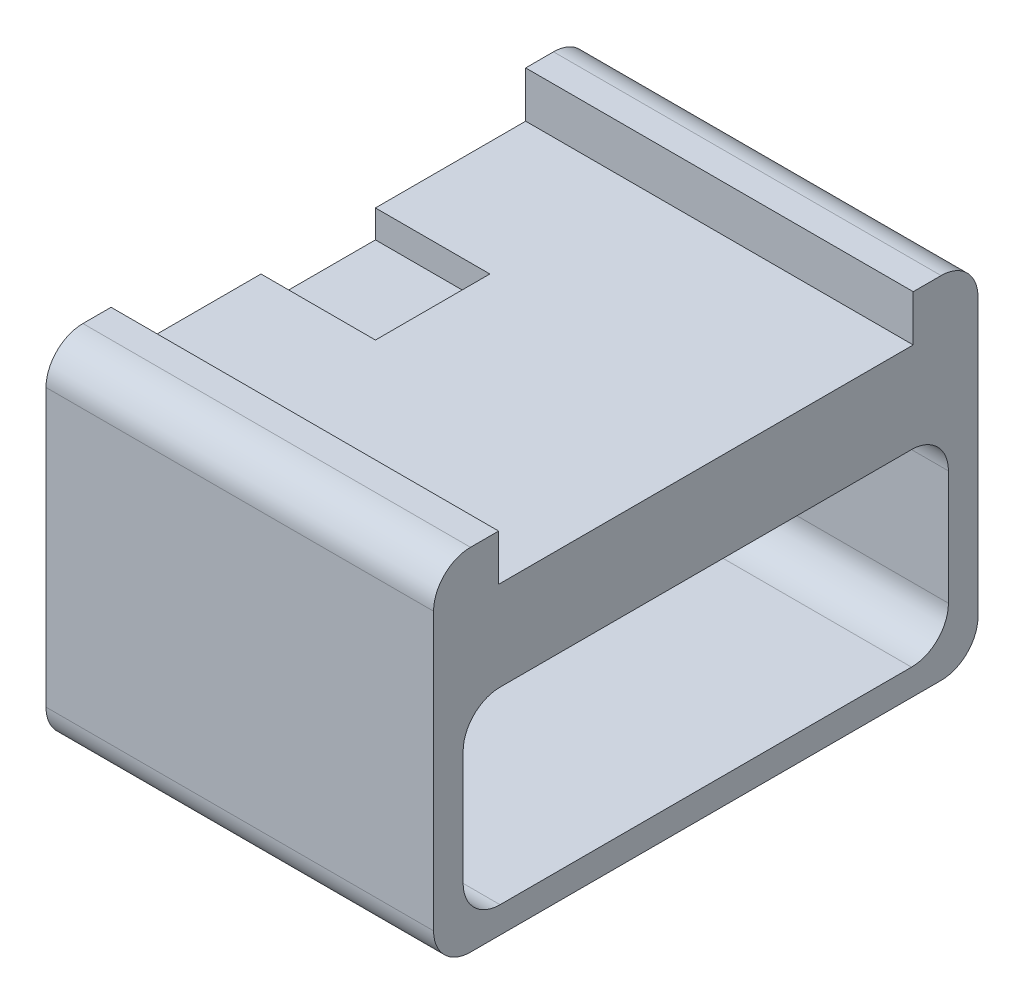
ISO-10303-21;
HEADER;
FILE_DESCRIPTION(('STEP AP214'),'2;1');
FILE_NAME('part.step','',(''),(''),'','','');
FILE_SCHEMA(('AUTOMOTIVE_DESIGN { 1 0 10303 214 1 1 1 1 }'));
ENDSEC;
DATA;
#1=APPLICATION_CONTEXT('core data for automotive mechanical design processes');
#2=APPLICATION_PROTOCOL_DEFINITION('international standard','automotive_design',2000,#1);
#3=PRODUCT_CONTEXT('',#1,'mechanical');
#4=PRODUCT('Part','Part','',(#3));
#5=PRODUCT_RELATED_PRODUCT_CATEGORY('part','',(#4));
#6=PRODUCT_DEFINITION_FORMATION('','',#4);
#7=PRODUCT_DEFINITION_CONTEXT('part definition',#1,'design');
#8=PRODUCT_DEFINITION('design','',#6,#7);
#9=PRODUCT_DEFINITION_SHAPE('','',#8);
#10=(LENGTH_UNIT() NAMED_UNIT(*) SI_UNIT(.MILLI.,.METRE.));
#11=(NAMED_UNIT(*) PLANE_ANGLE_UNIT() SI_UNIT($,.RADIAN.));
#12=(NAMED_UNIT(*) SI_UNIT($,.STERADIAN.) SOLID_ANGLE_UNIT());
#13=UNCERTAINTY_MEASURE_WITH_UNIT(LENGTH_MEASURE(1.E-05),#10,'distance_accuracy_value','');
#14=(GEOMETRIC_REPRESENTATION_CONTEXT(3) GLOBAL_UNCERTAINTY_ASSIGNED_CONTEXT((#13)) GLOBAL_UNIT_ASSIGNED_CONTEXT((#10,
#11,#12)) REPRESENTATION_CONTEXT('',''));
#15=CARTESIAN_POINT('',(0.,0.,0.));
#16=DIRECTION('',(0.,0.,1.));
#17=DIRECTION('',(1.,0.,0.));
#18=AXIS2_PLACEMENT_3D('',#15,#16,#17);
#19=CARTESIAN_POINT('',(21.,9.5,12.75));
#20=DIRECTION('',(0.,-1.,0.));
#21=DIRECTION('',(0.,0.,-1.));
#22=AXIS2_PLACEMENT_3D('',#19,#20,#21);
#23=PLANE('',#22);
#24=DIRECTION('',(0.,0.,1.));
#25=VECTOR('',#24,1.);
#26=CARTESIAN_POINT('',(0.,9.5,12.75));
#27=LINE('',#26,#25);
#28=CARTESIAN_POINT('',(0.,9.5,-12.75));
#29=VERTEX_POINT('',#28);
#30=CARTESIAN_POINT('',(0.,9.5,-11.2400373427258));
#31=VERTEX_POINT('',#30);
#32=EDGE_CURVE('E197',#29,#31,#27,.T.);
#33=ORIENTED_EDGE('',*,*,#32,.T.);
#34=DIRECTION('',(-1.,0.,0.));
#35=VECTOR('',#34,1.);
#36=CARTESIAN_POINT('',(0.,9.5,-11.2400373427258));
#37=LINE('',#36,#35);
#38=CARTESIAN_POINT('',(21.,9.5,-11.2400373427258));
#39=VERTEX_POINT('',#38);
#40=EDGE_CURVE('E317',#39,#31,#37,.T.);
#41=ORIENTED_EDGE('',*,*,#40,.F.);
#42=DIRECTION('',(0.,0.,1.));
#43=VECTOR('',#42,1.);
#44=CARTESIAN_POINT('',(21.,9.5,12.75));
#45=LINE('',#44,#43);
#46=CARTESIAN_POINT('',(21.,9.5,-12.75));
#47=VERTEX_POINT('',#46);
#48=EDGE_CURVE('E285',#47,#39,#45,.T.);
#49=ORIENTED_EDGE('',*,*,#48,.F.);
#50=DIRECTION('',(-1.,0.,0.));
#51=VECTOR('',#50,1.);
#52=CARTESIAN_POINT('',(21.,9.5,-12.75));
#53=LINE('',#52,#51);
#54=EDGE_CURVE('E215',#47,#29,#53,.T.);
#55=ORIENTED_EDGE('',*,*,#54,.T.);
#56=EDGE_LOOP('',(#33,#41,#49,#55));
#57=FACE_BOUND('',#56,.T.);
#58=ADVANCED_FACE('F33',(#57),#23,.F.);
#59=CARTESIAN_POINT('',(6.2,5.5,-3.1));
#60=DIRECTION('',(1.,0.,0.));
#61=DIRECTION('',(0.,0.,-1.));
#62=AXIS2_PLACEMENT_3D('',#59,#60,#61);
#63=PLANE('',#62);
#64=DIRECTION('',(0.,0.,1.));
#65=VECTOR('',#64,1.);
#66=CARTESIAN_POINT('',(6.2,7.,-3.1));
#67=LINE('',#66,#65);
#68=CARTESIAN_POINT('',(6.2,7.,-3.1));
#69=VERTEX_POINT('',#68);
#70=CARTESIAN_POINT('',(6.2,7.,3.1));
#71=VERTEX_POINT('',#70);
#72=EDGE_CURVE('E333',#69,#71,#67,.T.);
#73=ORIENTED_EDGE('',*,*,#72,.F.);
#74=DIRECTION('',(0.,1.,0.));
#75=VECTOR('',#74,1.);
#76=CARTESIAN_POINT('',(6.2,5.5,-3.1));
#77=LINE('',#76,#75);
#78=CARTESIAN_POINT('',(6.2,5.5,-3.1));
#79=VERTEX_POINT('',#78);
#80=EDGE_CURVE('E98',#79,#69,#77,.T.);
#81=ORIENTED_EDGE('',*,*,#80,.F.);
#82=DIRECTION('',(0.,0.,-1.));
#83=VECTOR('',#82,1.);
#84=CARTESIAN_POINT('',(6.2,5.5,-3.1));
#85=LINE('',#84,#83);
#86=CARTESIAN_POINT('',(6.2,5.5,3.1));
#87=VERTEX_POINT('',#86);
#88=EDGE_CURVE('E262',#87,#79,#85,.T.);
#89=ORIENTED_EDGE('',*,*,#88,.F.);
#90=DIRECTION('',(0.,1.,0.));
#91=VECTOR('',#90,1.);
#92=CARTESIAN_POINT('',(6.2,5.5,3.1));
#93=LINE('',#92,#91);
#94=EDGE_CURVE('E185',#87,#71,#93,.T.);
#95=ORIENTED_EDGE('',*,*,#94,.T.);
#96=EDGE_LOOP('',(#73,#81,#89,#95));
#97=FACE_BOUND('',#96,.T.);
#98=ADVANCED_FACE('F459',(#97),#63,.F.);
#99=CARTESIAN_POINT('',(6.2,5.5,3.1));
#100=DIRECTION('',(0.,0.,1.));
#101=DIRECTION('',(1.,0.,0.));
#102=AXIS2_PLACEMENT_3D('',#99,#100,#101);
#103=PLANE('',#102);
#104=DIRECTION('',(-1.,0.,0.));
#105=VECTOR('',#104,1.);
#106=CARTESIAN_POINT('',(6.2,7.,3.1));
#107=LINE('',#106,#105);
#108=CARTESIAN_POINT('',(0.,7.,3.1));
#109=VERTEX_POINT('',#108);
#110=EDGE_CURVE('E340',#71,#109,#107,.T.);
#111=ORIENTED_EDGE('',*,*,#110,.F.);
#112=ORIENTED_EDGE('',*,*,#94,.F.);
#113=DIRECTION('',(1.,0.,0.));
#114=VECTOR('',#113,1.);
#115=CARTESIAN_POINT('',(6.2,5.5,3.1));
#116=LINE('',#115,#114);
#117=CARTESIAN_POINT('',(0.,5.5,3.1));
#118=VERTEX_POINT('',#117);
#119=EDGE_CURVE('E270',#118,#87,#116,.T.);
#120=ORIENTED_EDGE('',*,*,#119,.F.);
#121=DIRECTION('',(0.,1.,0.));
#122=VECTOR('',#121,1.);
#123=CARTESIAN_POINT('',(0.,5.5,3.1));
#124=LINE('',#123,#122);
#125=EDGE_CURVE('E190',#118,#109,#124,.T.);
#126=ORIENTED_EDGE('',*,*,#125,.T.);
#127=EDGE_LOOP('',(#111,#112,#120,#126));
#128=FACE_BOUND('',#127,.T.);
#129=ADVANCED_FACE('F461',(#128),#103,.F.);
#130=CARTESIAN_POINT('',(6.2,5.5,-3.1));
#131=DIRECTION('',(0.,0.,-1.));
#132=DIRECTION('',(-1.,0.,0.));
#133=AXIS2_PLACEMENT_3D('',#130,#131,#132);
#134=PLANE('',#133);
#135=DIRECTION('',(1.,0.,0.));
#136=VECTOR('',#135,1.);
#137=CARTESIAN_POINT('',(6.2,7.,-3.1));
#138=LINE('',#137,#136);
#139=CARTESIAN_POINT('',(0.,7.,-3.1));
#140=VERTEX_POINT('',#139);
#141=EDGE_CURVE('E11',#140,#69,#138,.T.);
#142=ORIENTED_EDGE('',*,*,#141,.F.);
#143=DIRECTION('',(0.,1.,0.));
#144=VECTOR('',#143,1.);
#145=CARTESIAN_POINT('',(0.,5.5,-3.1));
#146=LINE('',#145,#144);
#147=CARTESIAN_POINT('',(0.,5.5,-3.1));
#148=VERTEX_POINT('',#147);
#149=EDGE_CURVE('E275',#148,#140,#146,.T.);
#150=ORIENTED_EDGE('',*,*,#149,.F.);
#151=DIRECTION('',(-1.,0.,0.));
#152=VECTOR('',#151,1.);
#153=CARTESIAN_POINT('',(6.2,5.5,-3.1));
#154=LINE('',#153,#152);
#155=EDGE_CURVE('E265',#79,#148,#154,.T.);
#156=ORIENTED_EDGE('',*,*,#155,.F.);
#157=ORIENTED_EDGE('',*,*,#80,.T.);
#158=EDGE_LOOP('',(#142,#150,#156,#157));
#159=FACE_BOUND('',#158,.T.);
#160=ADVANCED_FACE('F455',(#159),#134,.F.);
#161=CARTESIAN_POINT('',(21.,-7.5,-12.75));
#162=DIRECTION('',(-1.,0.,0.));
#163=DIRECTION('',(0.,0.,1.));
#164=AXIS2_PLACEMENT_3D('',#161,#162,#163);
#165=CYLINDRICAL_SURFACE('',#164,2.);
#166=CARTESIAN_POINT('',(0.,-7.5,-12.75));
#167=DIRECTION('',(1.,0.,0.));
#168=DIRECTION('',(0.,0.,1.));
#169=AXIS2_PLACEMENT_3D('',#166,#167,#168);
#170=CIRCLE('',#169,2.);
#171=CARTESIAN_POINT('',(0.,-9.5,-12.75));
#172=VERTEX_POINT('',#171);
#173=CARTESIAN_POINT('',(0.,-7.5,-14.75));
#174=VERTEX_POINT('',#173);
#175=EDGE_CURVE('E175',#172,#174,#170,.T.);
#176=ORIENTED_EDGE('',*,*,#175,.T.);
#177=DIRECTION('',(-1.,0.,0.));
#178=VECTOR('',#177,1.);
#179=CARTESIAN_POINT('',(21.,-7.5,-14.75));
#180=LINE('',#179,#178);
#181=CARTESIAN_POINT('',(21.,-7.5,-14.75));
#182=VERTEX_POINT('',#181);
#183=EDGE_CURVE('E221',#182,#174,#180,.T.);
#184=ORIENTED_EDGE('',*,*,#183,.F.);
#185=CARTESIAN_POINT('',(21.,-7.5,-12.75));
#186=DIRECTION('',(1.,0.,0.));
#187=DIRECTION('',(0.,0.,1.));
#188=AXIS2_PLACEMENT_3D('',#185,#186,#187);
#189=CIRCLE('',#188,2.);
#190=CARTESIAN_POINT('',(21.,-9.5,-12.75));
#191=VERTEX_POINT('',#190);
#192=EDGE_CURVE('E169',#191,#182,#189,.T.);
#193=ORIENTED_EDGE('',*,*,#192,.F.);
#194=DIRECTION('',(-1.,0.,0.));
#195=VECTOR('',#194,1.);
#196=CARTESIAN_POINT('',(21.,-9.5,-12.75));
#197=LINE('',#196,#195);
#198=EDGE_CURVE('E162',#191,#172,#197,.T.);
#199=ORIENTED_EDGE('',*,*,#198,.T.);
#200=EDGE_LOOP('',(#176,#184,#193,#199));
#201=FACE_BOUND('',#200,.T.);
#202=ADVANCED_FACE('F35',(#201),#165,.T.);
#203=CARTESIAN_POINT('',(21.,-7.5,-14.75));
#204=DIRECTION('',(0.,0.,1.));
#205=DIRECTION('',(0.,-1.,0.));
#206=AXIS2_PLACEMENT_3D('',#203,#204,#205);
#207=PLANE('',#206);
#208=DIRECTION('',(0.,1.,0.));
#209=VECTOR('',#208,1.);
#210=CARTESIAN_POINT('',(0.,-7.5,-14.75));
#211=LINE('',#210,#209);
#212=CARTESIAN_POINT('',(0.,7.5,-14.75));
#213=VERTEX_POINT('',#212);
#214=EDGE_CURVE('E183',#174,#213,#211,.T.);
#215=ORIENTED_EDGE('',*,*,#214,.T.);
#216=DIRECTION('',(-1.,0.,0.));
#217=VECTOR('',#216,1.);
#218=CARTESIAN_POINT('',(21.,7.5,-14.75));
#219=LINE('',#218,#217);
#220=CARTESIAN_POINT('',(21.,7.5,-14.75));
#221=VERTEX_POINT('',#220);
#222=EDGE_CURVE('E218',#221,#213,#219,.T.);
#223=ORIENTED_EDGE('',*,*,#222,.F.);
#224=DIRECTION('',(0.,1.,0.));
#225=VECTOR('',#224,1.);
#226=CARTESIAN_POINT('',(21.,-7.5,-14.75));
#227=LINE('',#226,#225);
#228=EDGE_CURVE('E280',#182,#221,#227,.T.);
#229=ORIENTED_EDGE('',*,*,#228,.F.);
#230=ORIENTED_EDGE('',*,*,#183,.T.);
#231=EDGE_LOOP('',(#215,#223,#229,#230));
#232=FACE_BOUND('',#231,.T.);
#233=ADVANCED_FACE('F298',(#232),#207,.F.);
#234=CARTESIAN_POINT('',(21.,7.5,-12.75));
#235=DIRECTION('',(-1.,0.,0.));
#236=DIRECTION('',(0.,0.,1.));
#237=AXIS2_PLACEMENT_3D('',#234,#235,#236);
#238=CYLINDRICAL_SURFACE('',#237,2.);
#239=CARTESIAN_POINT('',(0.,7.5,-12.75));
#240=DIRECTION('',(1.,0.,0.));
#241=DIRECTION('',(0.,0.,1.));
#242=AXIS2_PLACEMENT_3D('',#239,#240,#241);
#243=CIRCLE('',#242,2.);
#244=EDGE_CURVE('E187',#213,#29,#243,.T.);
#245=ORIENTED_EDGE('',*,*,#244,.T.);
#246=ORIENTED_EDGE('',*,*,#54,.F.);
#247=CARTESIAN_POINT('',(21.,7.5,-12.75));
#248=DIRECTION('',(1.,0.,0.));
#249=DIRECTION('',(0.,0.,1.));
#250=AXIS2_PLACEMENT_3D('',#247,#248,#249);
#251=CIRCLE('',#250,2.);
#252=EDGE_CURVE('E282',#221,#47,#251,.T.);
#253=ORIENTED_EDGE('',*,*,#252,.F.);
#254=ORIENTED_EDGE('',*,*,#222,.T.);
#255=EDGE_LOOP('',(#245,#246,#253,#254));
#256=FACE_BOUND('',#255,.T.);
#257=ADVANCED_FACE('F302',(#256),#238,.T.);
#258=CARTESIAN_POINT('',(21.,9.5,11.2248067322085));
#259=VERTEX_POINT('',#258);
#260=CARTESIAN_POINT('',(21.,9.5,12.75));
#261=VERTEX_POINT('',#260);
#262=EDGE_CURVE('E284',#259,#261,#45,.T.);
#263=ORIENTED_EDGE('',*,*,#262,.F.);
#264=DIRECTION('',(1.,0.,0.));
#265=VECTOR('',#264,1.);
#266=CARTESIAN_POINT('',(0.,9.5,11.2248067322085));
#267=LINE('',#266,#265);
#268=CARTESIAN_POINT('',(0.,9.5,11.2248067322085));
#269=VERTEX_POINT('',#268);
#270=EDGE_CURVE('E323',#269,#259,#267,.T.);
#271=ORIENTED_EDGE('',*,*,#270,.F.);
#272=CARTESIAN_POINT('',(0.,9.5,12.75));
#273=VERTEX_POINT('',#272);
#274=EDGE_CURVE('E196',#269,#273,#27,.T.);
#275=ORIENTED_EDGE('',*,*,#274,.T.);
#276=DIRECTION('',(-1.,0.,0.));
#277=VECTOR('',#276,1.);
#278=CARTESIAN_POINT('',(21.,9.5,12.75));
#279=LINE('',#278,#277);
#280=EDGE_CURVE('E212',#261,#273,#279,.T.);
#281=ORIENTED_EDGE('',*,*,#280,.F.);
#282=EDGE_LOOP('',(#263,#271,#275,#281));
#283=FACE_BOUND('',#282,.T.);
#284=ADVANCED_FACE('F443',(#283),#23,.F.);
#285=CARTESIAN_POINT('',(21.,7.5,12.75));
#286=DIRECTION('',(-1.,0.,0.));
#287=DIRECTION('',(0.,0.,1.));
#288=AXIS2_PLACEMENT_3D('',#285,#286,#287);
#289=CYLINDRICAL_SURFACE('',#288,2.);
#290=CARTESIAN_POINT('',(0.,7.5,12.75));
#291=DIRECTION('',(1.,0.,0.));
#292=DIRECTION('',(0.,0.,-1.));
#293=AXIS2_PLACEMENT_3D('',#290,#291,#292);
#294=CIRCLE('',#293,2.);
#295=CARTESIAN_POINT('',(0.,7.5,14.75));
#296=VERTEX_POINT('',#295);
#297=EDGE_CURVE('E200',#273,#296,#294,.T.);
#298=ORIENTED_EDGE('',*,*,#297,.T.);
#299=DIRECTION('',(-1.,0.,0.));
#300=VECTOR('',#299,1.);
#301=CARTESIAN_POINT('',(21.,7.5,14.75));
#302=LINE('',#301,#300);
#303=CARTESIAN_POINT('',(21.,7.5,14.75));
#304=VERTEX_POINT('',#303);
#305=EDGE_CURVE('E209',#304,#296,#302,.T.);
#306=ORIENTED_EDGE('',*,*,#305,.F.);
#307=CARTESIAN_POINT('',(21.,7.5,12.75));
#308=DIRECTION('',(1.,0.,0.));
#309=DIRECTION('',(0.,0.,-1.));
#310=AXIS2_PLACEMENT_3D('',#307,#308,#309);
#311=CIRCLE('',#310,2.);
#312=EDGE_CURVE('E288',#261,#304,#311,.T.);
#313=ORIENTED_EDGE('',*,*,#312,.F.);
#314=ORIENTED_EDGE('',*,*,#280,.T.);
#315=EDGE_LOOP('',(#298,#306,#313,#314));
#316=FACE_BOUND('',#315,.T.);
#317=ADVANCED_FACE('F446',(#316),#289,.T.);
#318=CARTESIAN_POINT('',(21.,-7.5,14.75));
#319=DIRECTION('',(0.,0.,-1.));
#320=DIRECTION('',(-1.,0.,0.));
#321=AXIS2_PLACEMENT_3D('',#318,#319,#320);
#322=PLANE('',#321);
#323=DIRECTION('',(0.,-1.,0.));
#324=VECTOR('',#323,1.);
#325=CARTESIAN_POINT('',(0.,-7.5,14.75));
#326=LINE('',#325,#324);
#327=CARTESIAN_POINT('',(0.,-7.5,14.75));
#328=VERTEX_POINT('',#327);
#329=EDGE_CURVE('E202',#296,#328,#326,.T.);
#330=ORIENTED_EDGE('',*,*,#329,.T.);
#331=DIRECTION('',(-1.,0.,0.));
#332=VECTOR('',#331,1.);
#333=CARTESIAN_POINT('',(21.,-7.5,14.75));
#334=LINE('',#333,#332);
#335=CARTESIAN_POINT('',(21.,-7.5,14.75));
#336=VERTEX_POINT('',#335);
#337=EDGE_CURVE('E206',#336,#328,#334,.T.);
#338=ORIENTED_EDGE('',*,*,#337,.F.);
#339=DIRECTION('',(0.,-1.,0.));
#340=VECTOR('',#339,1.);
#341=CARTESIAN_POINT('',(21.,-7.5,14.75));
#342=LINE('',#341,#340);
#343=EDGE_CURVE('E290',#304,#336,#342,.T.);
#344=ORIENTED_EDGE('',*,*,#343,.F.);
#345=ORIENTED_EDGE('',*,*,#305,.T.);
#346=EDGE_LOOP('',(#330,#338,#344,#345));
#347=FACE_BOUND('',#346,.T.);
#348=ADVANCED_FACE('F482',(#347),#322,.F.);
#349=CARTESIAN_POINT('',(21.,-7.5,12.75));
#350=DIRECTION('',(-1.,0.,0.));
#351=DIRECTION('',(0.,0.,1.));
#352=AXIS2_PLACEMENT_3D('',#349,#350,#351);
#353=CYLINDRICAL_SURFACE('',#352,2.);
#354=CARTESIAN_POINT('',(0.,-7.5,12.75));
#355=DIRECTION('',(1.,0.,0.));
#356=DIRECTION('',(0.,0.,-1.));
#357=AXIS2_PLACEMENT_3D('',#354,#355,#356);
#358=CIRCLE('',#357,2.);
#359=CARTESIAN_POINT('',(0.,-9.5,12.75));
#360=VERTEX_POINT('',#359);
#361=EDGE_CURVE('E170',#328,#360,#358,.T.);
#362=ORIENTED_EDGE('',*,*,#361,.T.);
#363=DIRECTION('',(-1.,0.,0.));
#364=VECTOR('',#363,1.);
#365=CARTESIAN_POINT('',(21.,-9.5,12.75));
#366=LINE('',#365,#364);
#367=CARTESIAN_POINT('',(21.,-9.5,12.75));
#368=VERTEX_POINT('',#367);
#369=EDGE_CURVE('E165',#368,#360,#366,.T.);
#370=ORIENTED_EDGE('',*,*,#369,.F.);
#371=CARTESIAN_POINT('',(21.,-7.5,12.75));
#372=DIRECTION('',(1.,0.,0.));
#373=DIRECTION('',(0.,0.,-1.));
#374=AXIS2_PLACEMENT_3D('',#371,#372,#373);
#375=CIRCLE('',#374,2.);
#376=EDGE_CURVE('E291',#336,#368,#375,.T.);
#377=ORIENTED_EDGE('',*,*,#376,.F.);
#378=ORIENTED_EDGE('',*,*,#337,.T.);
#379=EDGE_LOOP('',(#362,#370,#377,#378));
#380=FACE_BOUND('',#379,.T.);
#381=ADVANCED_FACE('F636',(#380),#353,.T.);
#382=CARTESIAN_POINT('',(21.,-9.5,12.75));
#383=DIRECTION('',(0.,1.,0.));
#384=DIRECTION('',(0.,0.,1.));
#385=AXIS2_PLACEMENT_3D('',#382,#383,#384);
#386=PLANE('',#385);
#387=DIRECTION('',(0.,0.,-1.));
#388=VECTOR('',#387,1.);
#389=CARTESIAN_POINT('',(0.,-9.5,12.75));
#390=LINE('',#389,#388);
#391=EDGE_CURVE('E158',#360,#172,#390,.T.);
#392=ORIENTED_EDGE('',*,*,#391,.T.);
#393=ORIENTED_EDGE('',*,*,#198,.F.);
#394=DIRECTION('',(0.,0.,-1.));
#395=VECTOR('',#394,1.);
#396=CARTESIAN_POINT('',(21.,-9.5,12.75));
#397=LINE('',#396,#395);
#398=EDGE_CURVE('E177',#368,#191,#397,.T.);
#399=ORIENTED_EDGE('',*,*,#398,.F.);
#400=ORIENTED_EDGE('',*,*,#369,.T.);
#401=EDGE_LOOP('',(#392,#393,#399,#400));
#402=FACE_BOUND('',#401,.T.);
#403=ADVANCED_FACE('F160',(#402),#386,.F.);
#404=CARTESIAN_POINT('',(21.,-7.5,-12.75));
#405=DIRECTION('',(-1.,0.,0.));
#406=DIRECTION('',(0.,0.,1.));
#407=AXIS2_PLACEMENT_3D('',#404,#405,#406);
#408=PLANE('',#407);
#409=ORIENTED_EDGE('',*,*,#48,.T.);
#410=DIRECTION('',(0.,-1.,0.));
#411=VECTOR('',#410,1.);
#412=CARTESIAN_POINT('',(21.,-7.5,-11.2400373427258));
#413=LINE('',#412,#411);
#414=CARTESIAN_POINT('',(21.,7.,-11.2400373427258));
#415=VERTEX_POINT('',#414);
#416=EDGE_CURVE('E309',#39,#415,#413,.T.);
#417=ORIENTED_EDGE('',*,*,#416,.T.);
#418=DIRECTION('',(0.,0.,-1.));
#419=VECTOR('',#418,1.);
#420=CARTESIAN_POINT('',(21.,7.,-12.75));
#421=LINE('',#420,#419);
#422=CARTESIAN_POINT('',(21.,7.,11.2248067322085));
#423=VERTEX_POINT('',#422);
#424=EDGE_CURVE('E343',#423,#415,#421,.T.);
#425=ORIENTED_EDGE('',*,*,#424,.F.);
#426=DIRECTION('',(0.,1.,0.));
#427=VECTOR('',#426,1.);
#428=CARTESIAN_POINT('',(21.,-7.5,11.2248067322085));
#429=LINE('',#428,#427);
#430=EDGE_CURVE('E346',#423,#259,#429,.T.);
#431=ORIENTED_EDGE('',*,*,#430,.T.);
#432=ORIENTED_EDGE('',*,*,#262,.T.);
#433=ORIENTED_EDGE('',*,*,#312,.T.);
#434=ORIENTED_EDGE('',*,*,#343,.T.);
#435=ORIENTED_EDGE('',*,*,#376,.T.);
#436=ORIENTED_EDGE('',*,*,#398,.T.);
#437=ORIENTED_EDGE('',*,*,#192,.T.);
#438=ORIENTED_EDGE('',*,*,#228,.T.);
#439=ORIENTED_EDGE('',*,*,#252,.T.);
#440=EDGE_LOOP('',(#409,#417,#425,#431,#432,#433,#434,#435,#436,#437,#438,#439));
#441=FACE_BOUND('',#440,.T.);
#442=DIRECTION('',(0.,0.,1.));
#443=VECTOR('',#442,1.);
#444=CARTESIAN_POINT('',(21.,-8.07292875406995,-11.147623692795));
#445=LINE('',#444,#443);
#446=CARTESIAN_POINT('',(21.,-8.07292875406995,-11.147623692795));
#447=VERTEX_POINT('',#446);
#448=CARTESIAN_POINT('',(21.,-8.07292875406995,11.147623692795));
#449=VERTEX_POINT('',#448);
#450=EDGE_CURVE('E258',#447,#449,#445,.T.);
#451=ORIENTED_EDGE('',*,*,#450,.T.);
#452=CARTESIAN_POINT('',(21.,-6.07292875406995,11.147623692795));
#453=DIRECTION('',(-1.,0.,0.));
#454=DIRECTION('',(0.,0.,1.));
#455=AXIS2_PLACEMENT_3D('',#452,#453,#454);
#456=CIRCLE('',#455,2.);
#457=CARTESIAN_POINT('',(21.,-6.07292875406995,13.147623692795));
#458=VERTEX_POINT('',#457);
#459=EDGE_CURVE('E350',#449,#458,#456,.T.);
#460=ORIENTED_EDGE('',*,*,#459,.T.);
#461=DIRECTION('',(0.,1.,0.));
#462=VECTOR('',#461,1.);
#463=CARTESIAN_POINT('',(21.,-6.07292875406995,13.147623692795));
#464=LINE('',#463,#462);
#465=CARTESIAN_POINT('',(21.,0.135263403800992,13.147623692795));
#466=VERTEX_POINT('',#465);
#467=EDGE_CURVE('E353',#458,#466,#464,.T.);
#468=ORIENTED_EDGE('',*,*,#467,.T.);
#469=CARTESIAN_POINT('',(21.,0.135263403800991,11.147623692795));
#470=DIRECTION('',(-1.,0.,0.));
#471=DIRECTION('',(0.,0.,-1.));
#472=AXIS2_PLACEMENT_3D('',#469,#470,#471);
#473=CIRCLE('',#472,2.);
#474=CARTESIAN_POINT('',(21.,2.13526340380099,11.147623692795));
#475=VERTEX_POINT('',#474);
#476=EDGE_CURVE('E56',#466,#475,#473,.T.);
#477=ORIENTED_EDGE('',*,*,#476,.T.);
#478=DIRECTION('',(0.,0.,-1.));
#479=VECTOR('',#478,1.);
#480=CARTESIAN_POINT('',(21.,2.13526340380099,-11.147623692795));
#481=LINE('',#480,#479);
#482=CARTESIAN_POINT('',(21.,2.13526340380099,-11.147623692795));
#483=VERTEX_POINT('',#482);
#484=EDGE_CURVE('E356',#475,#483,#481,.T.);
#485=ORIENTED_EDGE('',*,*,#484,.T.);
#486=CARTESIAN_POINT('',(21.,0.135263403800991,-11.147623692795));
#487=DIRECTION('',(-1.,0.,0.));
#488=DIRECTION('',(0.,0.,-1.));
#489=AXIS2_PLACEMENT_3D('',#486,#487,#488);
#490=CIRCLE('',#489,2.);
#491=CARTESIAN_POINT('',(21.,0.135263403800991,-13.147623692795));
#492=VERTEX_POINT('',#491);
#493=EDGE_CURVE('E359',#483,#492,#490,.T.);
#494=ORIENTED_EDGE('',*,*,#493,.T.);
#495=DIRECTION('',(0.,-1.,0.));
#496=VECTOR('',#495,1.);
#497=CARTESIAN_POINT('',(21.,-6.07292875406995,-13.147623692795));
#498=LINE('',#497,#496);
#499=CARTESIAN_POINT('',(21.,-6.07292875406995,-13.147623692795));
#500=VERTEX_POINT('',#499);
#501=EDGE_CURVE('E362',#492,#500,#498,.T.);
#502=ORIENTED_EDGE('',*,*,#501,.T.);
#503=CARTESIAN_POINT('',(21.,-6.07292875406995,-11.147623692795));
#504=DIRECTION('',(-1.,0.,0.));
#505=DIRECTION('',(0.,0.,1.));
#506=AXIS2_PLACEMENT_3D('',#503,#504,#505);
#507=CIRCLE('',#506,2.);
#508=EDGE_CURVE('E365',#500,#447,#507,.T.);
#509=ORIENTED_EDGE('',*,*,#508,.T.);
#510=EDGE_LOOP('',(#451,#460,#468,#477,#485,#494,#502,#509));
#511=FACE_BOUND('',#510,.T.);
#512=ADVANCED_FACE('F294',(#441,#511),#408,.F.);
#513=CARTESIAN_POINT('',(0.,-7.5,-12.75));
#514=DIRECTION('',(-1.,0.,0.));
#515=DIRECTION('',(0.,0.,1.));
#516=AXIS2_PLACEMENT_3D('',#513,#514,#515);
#517=PLANE('',#516);
#518=DIRECTION('',(0.,1.,0.));
#519=VECTOR('',#518,1.);
#520=CARTESIAN_POINT('',(0.,7.,11.2248067322085));
#521=LINE('',#520,#519);
#522=CARTESIAN_POINT('',(0.,7.,11.2248067322085));
#523=VERTEX_POINT('',#522);
#524=EDGE_CURVE('E334',#523,#269,#521,.T.);
#525=ORIENTED_EDGE('',*,*,#524,.F.);
#526=DIRECTION('',(0.,0.,1.));
#527=VECTOR('',#526,1.);
#528=CARTESIAN_POINT('',(0.,7.,-11.2400373427258));
#529=LINE('',#528,#527);
#530=EDGE_CURVE('E322',#109,#523,#529,.T.);
#531=ORIENTED_EDGE('',*,*,#530,.F.);
#532=ORIENTED_EDGE('',*,*,#125,.F.);
#533=DIRECTION('',(0.,0.,1.));
#534=VECTOR('',#533,1.);
#535=CARTESIAN_POINT('',(0.,5.5,-3.1));
#536=LINE('',#535,#534);
#537=EDGE_CURVE('E268',#148,#118,#536,.T.);
#538=ORIENTED_EDGE('',*,*,#537,.F.);
#539=ORIENTED_EDGE('',*,*,#149,.T.);
#540=CARTESIAN_POINT('',(0.,7.,-11.2400373427258));
#541=VERTEX_POINT('',#540);
#542=EDGE_CURVE('E47',#541,#140,#529,.T.);
#543=ORIENTED_EDGE('',*,*,#542,.F.);
#544=DIRECTION('',(0.,1.,0.));
#545=VECTOR('',#544,1.);
#546=CARTESIAN_POINT('',(0.,7.,-11.2400373427258));
#547=LINE('',#546,#545);
#548=EDGE_CURVE('E331',#541,#31,#547,.T.);
#549=ORIENTED_EDGE('',*,*,#548,.T.);
#550=ORIENTED_EDGE('',*,*,#32,.F.);
#551=ORIENTED_EDGE('',*,*,#244,.F.);
#552=ORIENTED_EDGE('',*,*,#214,.F.);
#553=ORIENTED_EDGE('',*,*,#175,.F.);
#554=ORIENTED_EDGE('',*,*,#391,.F.);
#555=ORIENTED_EDGE('',*,*,#361,.F.);
#556=ORIENTED_EDGE('',*,*,#329,.F.);
#557=ORIENTED_EDGE('',*,*,#297,.F.);
#558=ORIENTED_EDGE('',*,*,#274,.F.);
#559=EDGE_LOOP('',(#525,#531,#532,#538,#539,#543,#549,#550,#551,#552,#553,#554,#555,#556,#557,#558));
#560=FACE_BOUND('',#559,.T.);
#561=CARTESIAN_POINT('',(0.,-6.07292875406995,11.147623692795));
#562=DIRECTION('',(-1.,0.,0.));
#563=DIRECTION('',(0.,0.,1.));
#564=AXIS2_PLACEMENT_3D('',#561,#562,#563);
#565=CIRCLE('',#564,2.);
#566=CARTESIAN_POINT('',(0.,-8.07292875406995,11.147623692795));
#567=VERTEX_POINT('',#566);
#568=CARTESIAN_POINT('',(0.,-6.07292875406995,13.147623692795));
#569=VERTEX_POINT('',#568);
#570=EDGE_CURVE('E41',#567,#569,#565,.T.);
#571=ORIENTED_EDGE('',*,*,#570,.F.);
#572=DIRECTION('',(0.,0.,-1.));
#573=VECTOR('',#572,1.);
#574=CARTESIAN_POINT('',(0.,-8.07292875406995,-11.147623692795));
#575=LINE('',#574,#573);
#576=CARTESIAN_POINT('',(0.,-8.07292875406995,-11.147623692795));
#577=VERTEX_POINT('',#576);
#578=EDGE_CURVE('E89',#577,#567,#575,.F.);
#579=ORIENTED_EDGE('',*,*,#578,.F.);
#580=CARTESIAN_POINT('',(0.,-6.07292875406995,-11.147623692795));
#581=DIRECTION('',(-1.,0.,0.));
#582=DIRECTION('',(0.,0.,1.));
#583=AXIS2_PLACEMENT_3D('',#580,#581,#582);
#584=CIRCLE('',#583,2.);
#585=CARTESIAN_POINT('',(0.,-6.07292875406995,-13.147623692795));
#586=VERTEX_POINT('',#585);
#587=EDGE_CURVE('E233',#586,#577,#584,.T.);
#588=ORIENTED_EDGE('',*,*,#587,.F.);
#589=DIRECTION('',(0.,1.,0.));
#590=VECTOR('',#589,1.);
#591=CARTESIAN_POINT('',(0.,-6.07292875406995,-13.147623692795));
#592=LINE('',#591,#590);
#593=CARTESIAN_POINT('',(0.,0.135263403800991,-13.147623692795));
#594=VERTEX_POINT('',#593);
#595=EDGE_CURVE('E231',#594,#586,#592,.F.);
#596=ORIENTED_EDGE('',*,*,#595,.F.);
#597=CARTESIAN_POINT('',(0.,0.135263403800991,-11.147623692795));
#598=DIRECTION('',(-1.,0.,0.));
#599=DIRECTION('',(0.,0.,1.));
#600=AXIS2_PLACEMENT_3D('',#597,#598,#599);
#601=CIRCLE('',#600,2.);
#602=CARTESIAN_POINT('',(0.,2.13526340380099,-11.147623692795));
#603=VERTEX_POINT('',#602);
#604=EDGE_CURVE('E229',#603,#594,#601,.T.);
#605=ORIENTED_EDGE('',*,*,#604,.F.);
#606=DIRECTION('',(0.,0.,1.));
#607=VECTOR('',#606,1.);
#608=CARTESIAN_POINT('',(0.,2.13526340380099,-11.147623692795));
#609=LINE('',#608,#607);
#610=CARTESIAN_POINT('',(0.,2.13526340380099,11.147623692795));
#611=VERTEX_POINT('',#610);
#612=EDGE_CURVE('E227',#611,#603,#609,.F.);
#613=ORIENTED_EDGE('',*,*,#612,.F.);
#614=CARTESIAN_POINT('',(0.,0.135263403800991,11.147623692795));
#615=DIRECTION('',(-1.,0.,0.));
#616=DIRECTION('',(0.,0.,1.));
#617=AXIS2_PLACEMENT_3D('',#614,#615,#616);
#618=CIRCLE('',#617,2.);
#619=CARTESIAN_POINT('',(0.,0.135263403800991,13.147623692795));
#620=VERTEX_POINT('',#619);
#621=EDGE_CURVE('E225',#620,#611,#618,.T.);
#622=ORIENTED_EDGE('',*,*,#621,.F.);
#623=DIRECTION('',(0.,1.,0.));
#624=VECTOR('',#623,1.);
#625=CARTESIAN_POINT('',(0.,-6.07292875406995,13.147623692795));
#626=LINE('',#625,#624);
#627=EDGE_CURVE('E223',#569,#620,#626,.T.);
#628=ORIENTED_EDGE('',*,*,#627,.F.);
#629=EDGE_LOOP('',(#571,#579,#588,#596,#605,#613,#622,#628));
#630=FACE_BOUND('',#629,.T.);
#631=ADVANCED_FACE('F180',(#560,#630),#517,.T.);
#632=CARTESIAN_POINT('',(0.,5.5,0.));
#633=DIRECTION('',(0.,-1.,0.));
#634=DIRECTION('',(0.,0.,-1.));
#635=AXIS2_PLACEMENT_3D('',#632,#633,#634);
#636=PLANE('',#635);
#637=ORIENTED_EDGE('',*,*,#88,.T.);
#638=ORIENTED_EDGE('',*,*,#155,.T.);
#639=ORIENTED_EDGE('',*,*,#537,.T.);
#640=ORIENTED_EDGE('',*,*,#119,.T.);
#641=EDGE_LOOP('',(#637,#638,#639,#640));
#642=FACE_BOUND('',#641,.T.);
#643=ADVANCED_FACE('F457',(#642),#636,.F.);
#644=CARTESIAN_POINT('',(21.,-6.07292875406995,11.147623692795));
#645=DIRECTION('',(-1.,0.,0.));
#646=DIRECTION('',(0.,0.,1.));
#647=AXIS2_PLACEMENT_3D('',#644,#645,#646);
#648=CYLINDRICAL_SURFACE('',#647,2.);
#649=ORIENTED_EDGE('',*,*,#570,.T.);
#650=DIRECTION('',(-1.,0.,0.));
#651=VECTOR('',#650,1.);
#652=CARTESIAN_POINT('',(21.,-6.07292875406995,13.147623692795));
#653=LINE('',#652,#651);
#654=EDGE_CURVE('E243',#458,#569,#653,.T.);
#655=ORIENTED_EDGE('',*,*,#654,.F.);
#656=ORIENTED_EDGE('',*,*,#459,.F.);
#657=DIRECTION('',(-1.,0.,0.));
#658=VECTOR('',#657,1.);
#659=CARTESIAN_POINT('',(21.,-8.07292875406995,11.147623692795));
#660=LINE('',#659,#658);
#661=EDGE_CURVE('E245',#449,#567,#660,.T.);
#662=ORIENTED_EDGE('',*,*,#661,.T.);
#663=EDGE_LOOP('',(#649,#655,#656,#662));
#664=FACE_BOUND('',#663,.T.);
#665=ADVANCED_FACE('F240',(#664),#648,.F.);
#666=CARTESIAN_POINT('',(21.,-8.07292875406995,-11.147623692795));
#667=DIRECTION('',(0.,-1.,0.));
#668=DIRECTION('',(0.,0.,-1.));
#669=AXIS2_PLACEMENT_3D('',#666,#667,#668);
#670=PLANE('',#669);
#671=ORIENTED_EDGE('',*,*,#578,.T.);
#672=ORIENTED_EDGE('',*,*,#661,.F.);
#673=ORIENTED_EDGE('',*,*,#450,.F.);
#674=DIRECTION('',(-1.,0.,0.));
#675=VECTOR('',#674,1.);
#676=CARTESIAN_POINT('',(21.,-8.07292875406995,-11.147623692795));
#677=LINE('',#676,#675);
#678=EDGE_CURVE('E370',#447,#577,#677,.T.);
#679=ORIENTED_EDGE('',*,*,#678,.T.);
#680=EDGE_LOOP('',(#671,#672,#673,#679));
#681=FACE_BOUND('',#680,.T.);
#682=ADVANCED_FACE('F407',(#681),#670,.F.);
#683=CARTESIAN_POINT('',(21.,-6.07292875406995,-11.147623692795));
#684=DIRECTION('',(-1.,0.,0.));
#685=DIRECTION('',(0.,0.,1.));
#686=AXIS2_PLACEMENT_3D('',#683,#684,#685);
#687=CYLINDRICAL_SURFACE('',#686,2.);
#688=ORIENTED_EDGE('',*,*,#587,.T.);
#689=ORIENTED_EDGE('',*,*,#678,.F.);
#690=ORIENTED_EDGE('',*,*,#508,.F.);
#691=DIRECTION('',(-1.,0.,0.));
#692=VECTOR('',#691,1.);
#693=CARTESIAN_POINT('',(21.,-6.07292875406995,-13.147623692795));
#694=LINE('',#693,#692);
#695=EDGE_CURVE('E372',#500,#586,#694,.T.);
#696=ORIENTED_EDGE('',*,*,#695,.T.);
#697=EDGE_LOOP('',(#688,#689,#690,#696));
#698=FACE_BOUND('',#697,.T.);
#699=ADVANCED_FACE('F397',(#698),#687,.F.);
#700=CARTESIAN_POINT('',(21.,-6.07292875406995,-13.147623692795));
#701=DIRECTION('',(0.,0.,-1.));
#702=DIRECTION('',(-1.,0.,0.));
#703=AXIS2_PLACEMENT_3D('',#700,#701,#702);
#704=PLANE('',#703);
#705=ORIENTED_EDGE('',*,*,#595,.T.);
#706=ORIENTED_EDGE('',*,*,#695,.F.);
#707=ORIENTED_EDGE('',*,*,#501,.F.);
#708=DIRECTION('',(-1.,0.,0.));
#709=VECTOR('',#708,1.);
#710=CARTESIAN_POINT('',(21.,0.135263403800991,-13.147623692795));
#711=LINE('',#710,#709);
#712=EDGE_CURVE('E376',#492,#594,#711,.T.);
#713=ORIENTED_EDGE('',*,*,#712,.T.);
#714=EDGE_LOOP('',(#705,#706,#707,#713));
#715=FACE_BOUND('',#714,.T.);
#716=ADVANCED_FACE('F392',(#715),#704,.F.);
#717=CARTESIAN_POINT('',(21.,0.135263403800991,-11.147623692795));
#718=DIRECTION('',(-1.,0.,0.));
#719=DIRECTION('',(0.,0.,1.));
#720=AXIS2_PLACEMENT_3D('',#717,#718,#719);
#721=CYLINDRICAL_SURFACE('',#720,2.);
#722=ORIENTED_EDGE('',*,*,#604,.T.);
#723=ORIENTED_EDGE('',*,*,#712,.F.);
#724=ORIENTED_EDGE('',*,*,#493,.F.);
#725=DIRECTION('',(-1.,0.,0.));
#726=VECTOR('',#725,1.);
#727=CARTESIAN_POINT('',(21.,2.13526340380099,-11.147623692795));
#728=LINE('',#727,#726);
#729=EDGE_CURVE('E256',#483,#603,#728,.T.);
#730=ORIENTED_EDGE('',*,*,#729,.T.);
#731=EDGE_LOOP('',(#722,#723,#724,#730));
#732=FACE_BOUND('',#731,.T.);
#733=ADVANCED_FACE('F383',(#732),#721,.F.);
#734=CARTESIAN_POINT('',(21.,2.13526340380099,-11.147623692795));
#735=DIRECTION('',(0.,1.,0.));
#736=DIRECTION('',(0.,0.,1.));
#737=AXIS2_PLACEMENT_3D('',#734,#735,#736);
#738=PLANE('',#737);
#739=ORIENTED_EDGE('',*,*,#612,.T.);
#740=ORIENTED_EDGE('',*,*,#729,.F.);
#741=ORIENTED_EDGE('',*,*,#484,.F.);
#742=DIRECTION('',(-1.,0.,0.));
#743=VECTOR('',#742,1.);
#744=CARTESIAN_POINT('',(21.,2.13526340380099,11.147623692795));
#745=LINE('',#744,#743);
#746=EDGE_CURVE('E254',#475,#611,#745,.T.);
#747=ORIENTED_EDGE('',*,*,#746,.T.);
#748=EDGE_LOOP('',(#739,#740,#741,#747));
#749=FACE_BOUND('',#748,.T.);
#750=ADVANCED_FACE('F564',(#749),#738,.F.);
#751=CARTESIAN_POINT('',(21.,0.135263403800991,11.147623692795));
#752=DIRECTION('',(-1.,0.,0.));
#753=DIRECTION('',(0.,0.,1.));
#754=AXIS2_PLACEMENT_3D('',#751,#752,#753);
#755=CYLINDRICAL_SURFACE('',#754,2.);
#756=ORIENTED_EDGE('',*,*,#621,.T.);
#757=ORIENTED_EDGE('',*,*,#746,.F.);
#758=ORIENTED_EDGE('',*,*,#476,.F.);
#759=DIRECTION('',(-1.,0.,0.));
#760=VECTOR('',#759,1.);
#761=CARTESIAN_POINT('',(21.,0.135263403800991,13.147623692795));
#762=LINE('',#761,#760);
#763=EDGE_CURVE('E250',#466,#620,#762,.T.);
#764=ORIENTED_EDGE('',*,*,#763,.T.);
#765=EDGE_LOOP('',(#756,#757,#758,#764));
#766=FACE_BOUND('',#765,.T.);
#767=ADVANCED_FACE('F252',(#766),#755,.F.);
#768=CARTESIAN_POINT('',(21.,-6.07292875406995,13.147623692795));
#769=DIRECTION('',(0.,0.,1.));
#770=DIRECTION('',(1.,0.,0.));
#771=AXIS2_PLACEMENT_3D('',#768,#769,#770);
#772=PLANE('',#771);
#773=ORIENTED_EDGE('',*,*,#627,.T.);
#774=ORIENTED_EDGE('',*,*,#763,.F.);
#775=ORIENTED_EDGE('',*,*,#467,.F.);
#776=ORIENTED_EDGE('',*,*,#654,.T.);
#777=EDGE_LOOP('',(#773,#774,#775,#776));
#778=FACE_BOUND('',#777,.T.);
#779=ADVANCED_FACE('F249',(#778),#772,.F.);
#780=CARTESIAN_POINT('',(0.,7.,-11.2400373427258));
#781=DIRECTION('',(0.,0.,-1.));
#782=DIRECTION('',(-1.,0.,0.));
#783=AXIS2_PLACEMENT_3D('',#780,#781,#782);
#784=PLANE('',#783);
#785=ORIENTED_EDGE('',*,*,#40,.T.);
#786=ORIENTED_EDGE('',*,*,#548,.F.);
#787=DIRECTION('',(-1.,0.,0.));
#788=VECTOR('',#787,1.);
#789=CARTESIAN_POINT('',(0.,7.,-11.2400373427258));
#790=LINE('',#789,#788);
#791=EDGE_CURVE('E337',#415,#541,#790,.T.);
#792=ORIENTED_EDGE('',*,*,#791,.F.);
#793=ORIENTED_EDGE('',*,*,#416,.F.);
#794=EDGE_LOOP('',(#785,#786,#792,#793));
#795=FACE_BOUND('',#794,.T.);
#796=ADVANCED_FACE('F451',(#795),#784,.F.);
#797=CARTESIAN_POINT('',(0.,7.,11.2248067322085));
#798=DIRECTION('',(0.,0.,1.));
#799=DIRECTION('',(0.,-1.,0.));
#800=AXIS2_PLACEMENT_3D('',#797,#798,#799);
#801=PLANE('',#800);
#802=DIRECTION('',(1.,0.,0.));
#803=VECTOR('',#802,1.);
#804=CARTESIAN_POINT('',(0.,7.,11.2248067322085));
#805=LINE('',#804,#803);
#806=EDGE_CURVE('E430',#523,#423,#805,.T.);
#807=ORIENTED_EDGE('',*,*,#806,.F.);
#808=ORIENTED_EDGE('',*,*,#524,.T.);
#809=ORIENTED_EDGE('',*,*,#270,.T.);
#810=ORIENTED_EDGE('',*,*,#430,.F.);
#811=EDGE_LOOP('',(#807,#808,#809,#810));
#812=FACE_BOUND('',#811,.T.);
#813=ADVANCED_FACE('F434',(#812),#801,.F.);
#814=CARTESIAN_POINT('',(0.,7.,0.));
#815=DIRECTION('',(0.,1.,0.));
#816=DIRECTION('',(0.,0.,1.));
#817=AXIS2_PLACEMENT_3D('',#814,#815,#816);
#818=PLANE('',#817);
#819=ORIENTED_EDGE('',*,*,#424,.T.);
#820=ORIENTED_EDGE('',*,*,#791,.T.);
#821=ORIENTED_EDGE('',*,*,#542,.T.);
#822=ORIENTED_EDGE('',*,*,#141,.T.);
#823=ORIENTED_EDGE('',*,*,#72,.T.);
#824=ORIENTED_EDGE('',*,*,#110,.T.);
#825=ORIENTED_EDGE('',*,*,#530,.T.);
#826=ORIENTED_EDGE('',*,*,#806,.T.);
#827=EDGE_LOOP('',(#819,#820,#821,#822,#823,#824,#825,#826));
#828=FACE_BOUND('',#827,.T.);
#829=ADVANCED_FACE('F429',(#828),#818,.T.);
#830=CLOSED_SHELL('',(#58,#98,#129,#160,#202,#233,#257,#284,#317,#348,#381,#403,#512,#631,#643,
#665,#682,#699,#716,#733,#750,#767,#779,#796,#813,#829));
#831=MANIFOLD_SOLID_BREP('B2',#830);
#832=ADVANCED_BREP_SHAPE_REPRESENTATION('',(#18,#831),#14);
#833=SHAPE_DEFINITION_REPRESENTATION(#9,#832);
ENDSEC;
END-ISO-10303-21;
